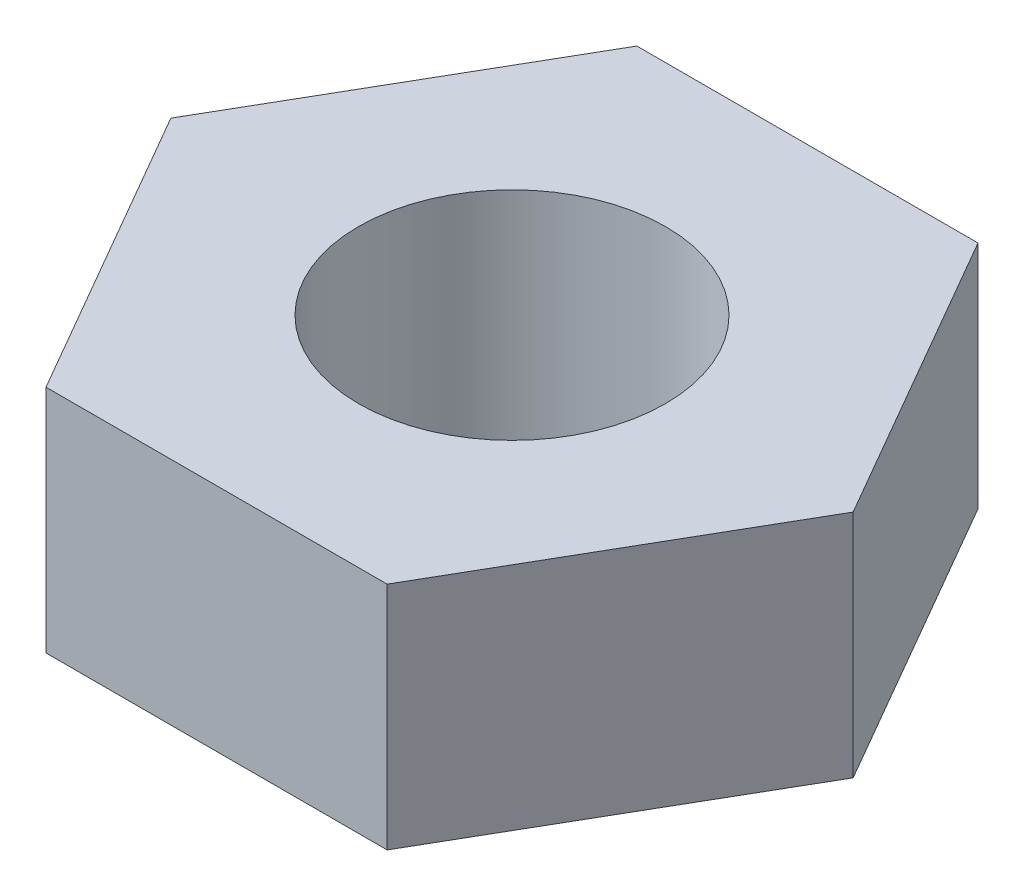
ISO-10303-21;
HEADER;
FILE_DESCRIPTION(('STEP AP214'),'2;1');
FILE_NAME('part.step','',(''),(''),'','','');
FILE_SCHEMA(('AUTOMOTIVE_DESIGN { 1 0 10303 214 1 1 1 1 }'));
ENDSEC;
DATA;
#1=APPLICATION_CONTEXT('core data for automotive mechanical design processes');
#2=APPLICATION_PROTOCOL_DEFINITION('international standard','automotive_design',2000,#1);
#3=PRODUCT_CONTEXT('',#1,'mechanical');
#4=PRODUCT('Part','Part','',(#3));
#5=PRODUCT_RELATED_PRODUCT_CATEGORY('part','',(#4));
#6=PRODUCT_DEFINITION_FORMATION('','',#4);
#7=PRODUCT_DEFINITION_CONTEXT('part definition',#1,'design');
#8=PRODUCT_DEFINITION('design','',#6,#7);
#9=PRODUCT_DEFINITION_SHAPE('','',#8);
#10=(LENGTH_UNIT() NAMED_UNIT(*) SI_UNIT(.MILLI.,.METRE.));
#11=(NAMED_UNIT(*) PLANE_ANGLE_UNIT() SI_UNIT($,.RADIAN.));
#12=(NAMED_UNIT(*) SI_UNIT($,.STERADIAN.) SOLID_ANGLE_UNIT());
#13=UNCERTAINTY_MEASURE_WITH_UNIT(LENGTH_MEASURE(1.E-05),#10,'distance_accuracy_value','');
#14=(GEOMETRIC_REPRESENTATION_CONTEXT(3) GLOBAL_UNCERTAINTY_ASSIGNED_CONTEXT((#13)) GLOBAL_UNIT_ASSIGNED_CONTEXT((#10,
#11,#12)) REPRESENTATION_CONTEXT('',''));
#15=CARTESIAN_POINT('',(0.,0.,0.));
#16=DIRECTION('',(0.,0.,1.));
#17=DIRECTION('',(1.,0.,0.));
#18=AXIS2_PLACEMENT_3D('',#15,#16,#17);
#19=CARTESIAN_POINT('',(0.,1.5,0.));
#20=DIRECTION('',(0.,1.,0.));
#21=DIRECTION('',(0.,0.,1.));
#22=AXIS2_PLACEMENT_3D('',#19,#20,#21);
#23=PLANE('',#22);
#24=DIRECTION('',(-0.5,0.,-0.866025403784439));
#25=VECTOR('',#24,1.);
#26=CARTESIAN_POINT('',(2.22279853638006,1.5,0.));
#27=LINE('',#26,#25);
#28=CARTESIAN_POINT('',(2.22279853638006,1.5,0.));
#29=VERTEX_POINT('',#28);
#30=CARTESIAN_POINT('',(1.11139926819003,1.5,-1.925));
#31=VERTEX_POINT('',#30);
#32=EDGE_CURVE('E139',#29,#31,#27,.T.);
#33=ORIENTED_EDGE('',*,*,#32,.T.);
#34=DIRECTION('',(-1.,0.,0.));
#35=VECTOR('',#34,1.);
#36=CARTESIAN_POINT('',(1.11139926819003,1.5,-1.925));
#37=LINE('',#36,#35);
#38=CARTESIAN_POINT('',(-1.11139926819003,1.5,-1.925));
#39=VERTEX_POINT('',#38);
#40=EDGE_CURVE('E97',#31,#39,#37,.T.);
#41=ORIENTED_EDGE('',*,*,#40,.T.);
#42=DIRECTION('',(-0.5,0.,0.866025403784439));
#43=VECTOR('',#42,1.);
#44=CARTESIAN_POINT('',(-1.11139926819003,1.5,-1.925));
#45=LINE('',#44,#43);
#46=CARTESIAN_POINT('',(-2.22279853638006,1.5,0.));
#47=VERTEX_POINT('',#46);
#48=EDGE_CURVE('E110',#39,#47,#45,.T.);
#49=ORIENTED_EDGE('',*,*,#48,.T.);
#50=DIRECTION('',(0.5,0.,0.866025403784439));
#51=VECTOR('',#50,1.);
#52=CARTESIAN_POINT('',(-2.22279853638006,1.5,0.));
#53=LINE('',#52,#51);
#54=CARTESIAN_POINT('',(-1.11139926819003,1.5,1.925));
#55=VERTEX_POINT('',#54);
#56=EDGE_CURVE('E104',#47,#55,#53,.T.);
#57=ORIENTED_EDGE('',*,*,#56,.T.);
#58=DIRECTION('',(1.,0.,0.));
#59=VECTOR('',#58,1.);
#60=CARTESIAN_POINT('',(-1.11139926819003,1.5,1.925));
#61=LINE('',#60,#59);
#62=CARTESIAN_POINT('',(1.11139926819003,1.5,1.925));
#63=VERTEX_POINT('',#62);
#64=EDGE_CURVE('E108',#55,#63,#61,.T.);
#65=ORIENTED_EDGE('',*,*,#64,.T.);
#66=DIRECTION('',(0.5,0.,-0.866025403784439));
#67=VECTOR('',#66,1.);
#68=CARTESIAN_POINT('',(1.11139926819003,1.5,1.925));
#69=LINE('',#68,#67);
#70=EDGE_CURVE('E60',#63,#29,#69,.T.);
#71=ORIENTED_EDGE('',*,*,#70,.T.);
#72=EDGE_LOOP('',(#33,#41,#49,#57,#65,#71));
#73=FACE_BOUND('',#72,.T.);
#74=CARTESIAN_POINT('',(0.,1.5,0.));
#75=DIRECTION('',(0.,1.,0.));
#76=DIRECTION('',(0.,0.,1.));
#77=AXIS2_PLACEMENT_3D('',#74,#75,#76);
#78=CIRCLE('',#77,1.);
#79=CARTESIAN_POINT('',(0.,1.5,1.));
#80=VERTEX_POINT('',#79);
#81=EDGE_CURVE('E132',#80,#80,#78,.T.);
#82=ORIENTED_EDGE('',*,*,#81,.F.);
#83=EDGE_LOOP('',(#82));
#84=FACE_BOUND('',#83,.T.);
#85=ADVANCED_FACE('F43',(#73,#84),#23,.T.);
#86=CARTESIAN_POINT('',(0.,0.,0.));
#87=DIRECTION('',(0.,1.,0.));
#88=DIRECTION('',(0.,0.,1.));
#89=AXIS2_PLACEMENT_3D('',#86,#87,#88);
#90=PLANE('',#89);
#91=DIRECTION('',(-0.5,0.,-0.866025403784439));
#92=VECTOR('',#91,1.);
#93=CARTESIAN_POINT('',(2.22279853638006,0.,0.));
#94=LINE('',#93,#92);
#95=CARTESIAN_POINT('',(2.22279853638006,0.,0.));
#96=VERTEX_POINT('',#95);
#97=CARTESIAN_POINT('',(1.11139926819003,0.,-1.925));
#98=VERTEX_POINT('',#97);
#99=EDGE_CURVE('E128',#96,#98,#94,.T.);
#100=ORIENTED_EDGE('',*,*,#99,.F.);
#101=DIRECTION('',(0.5,0.,-0.866025403784439));
#102=VECTOR('',#101,1.);
#103=CARTESIAN_POINT('',(1.11139926819003,0.,1.925));
#104=LINE('',#103,#102);
#105=CARTESIAN_POINT('',(1.11139926819003,0.,1.925));
#106=VERTEX_POINT('',#105);
#107=EDGE_CURVE('E89',#106,#96,#104,.T.);
#108=ORIENTED_EDGE('',*,*,#107,.F.);
#109=DIRECTION('',(1.,0.,0.));
#110=VECTOR('',#109,1.);
#111=CARTESIAN_POINT('',(-1.11139926819003,0.,1.925));
#112=LINE('',#111,#110);
#113=CARTESIAN_POINT('',(-1.11139926819003,0.,1.925));
#114=VERTEX_POINT('',#113);
#115=EDGE_CURVE('E83',#114,#106,#112,.T.);
#116=ORIENTED_EDGE('',*,*,#115,.F.);
#117=DIRECTION('',(0.5,0.,0.866025403784439));
#118=VECTOR('',#117,1.);
#119=CARTESIAN_POINT('',(-2.22279853638006,0.,0.));
#120=LINE('',#119,#118);
#121=CARTESIAN_POINT('',(-2.22279853638006,0.,0.));
#122=VERTEX_POINT('',#121);
#123=EDGE_CURVE('E118',#122,#114,#120,.T.);
#124=ORIENTED_EDGE('',*,*,#123,.F.);
#125=DIRECTION('',(-0.5,0.,0.866025403784439));
#126=VECTOR('',#125,1.);
#127=CARTESIAN_POINT('',(-1.11139926819003,0.,-1.925));
#128=LINE('',#127,#126);
#129=CARTESIAN_POINT('',(-1.11139926819003,0.,-1.925));
#130=VERTEX_POINT('',#129);
#131=EDGE_CURVE('E134',#130,#122,#128,.T.);
#132=ORIENTED_EDGE('',*,*,#131,.F.);
#133=DIRECTION('',(-1.,0.,0.));
#134=VECTOR('',#133,1.);
#135=CARTESIAN_POINT('',(1.11139926819003,0.,-1.925));
#136=LINE('',#135,#134);
#137=EDGE_CURVE('E131',#98,#130,#136,.T.);
#138=ORIENTED_EDGE('',*,*,#137,.F.);
#139=EDGE_LOOP('',(#100,#108,#116,#124,#132,#138));
#140=FACE_BOUND('',#139,.T.);
#141=CARTESIAN_POINT('',(0.,0.,0.));
#142=DIRECTION('',(0.,1.,0.));
#143=DIRECTION('',(0.,0.,1.));
#144=AXIS2_PLACEMENT_3D('',#141,#142,#143);
#145=CIRCLE('',#144,1.);
#146=CARTESIAN_POINT('',(0.,0.,1.));
#147=VERTEX_POINT('',#146);
#148=EDGE_CURVE('E268',#147,#147,#145,.T.);
#149=ORIENTED_EDGE('',*,*,#148,.T.);
#150=EDGE_LOOP('',(#149));
#151=FACE_BOUND('',#150,.T.);
#152=ADVANCED_FACE('F148',(#140,#151),#90,.F.);
#153=CARTESIAN_POINT('',(2.22279853638006,1.5,0.));
#154=DIRECTION('',(-0.866025403784439,0.,0.5));
#155=DIRECTION('',(0.5,0.,0.866025403784439));
#156=AXIS2_PLACEMENT_3D('',#153,#154,#155);
#157=PLANE('',#156);
#158=ORIENTED_EDGE('',*,*,#99,.T.);
#159=DIRECTION('',(0.,-1.,0.));
#160=VECTOR('',#159,1.);
#161=CARTESIAN_POINT('',(1.11139926819003,1.5,-1.925));
#162=LINE('',#161,#160);
#163=EDGE_CURVE('E11',#31,#98,#162,.T.);
#164=ORIENTED_EDGE('',*,*,#163,.F.);
#165=ORIENTED_EDGE('',*,*,#32,.F.);
#166=DIRECTION('',(0.,-1.,0.));
#167=VECTOR('',#166,1.);
#168=CARTESIAN_POINT('',(2.22279853638006,1.5,0.));
#169=LINE('',#168,#167);
#170=EDGE_CURVE('E124',#29,#96,#169,.T.);
#171=ORIENTED_EDGE('',*,*,#170,.T.);
#172=EDGE_LOOP('',(#158,#164,#165,#171));
#173=FACE_BOUND('',#172,.T.);
#174=ADVANCED_FACE('F45',(#173),#157,.F.);
#175=CARTESIAN_POINT('',(1.11139926819003,1.5,-1.925));
#176=DIRECTION('',(0.,0.,1.));
#177=DIRECTION('',(1.,0.,0.));
#178=AXIS2_PLACEMENT_3D('',#175,#176,#177);
#179=PLANE('',#178);
#180=ORIENTED_EDGE('',*,*,#137,.T.);
#181=DIRECTION('',(0.,-1.,0.));
#182=VECTOR('',#181,1.);
#183=CARTESIAN_POINT('',(-1.11139926819003,1.5,-1.925));
#184=LINE('',#183,#182);
#185=EDGE_CURVE('E52',#39,#130,#184,.T.);
#186=ORIENTED_EDGE('',*,*,#185,.F.);
#187=ORIENTED_EDGE('',*,*,#40,.F.);
#188=ORIENTED_EDGE('',*,*,#163,.T.);
#189=EDGE_LOOP('',(#180,#186,#187,#188));
#190=FACE_BOUND('',#189,.T.);
#191=ADVANCED_FACE('F173',(#190),#179,.F.);
#192=CARTESIAN_POINT('',(-1.11139926819003,1.5,-1.925));
#193=DIRECTION('',(0.866025403784439,0.,0.5));
#194=DIRECTION('',(0.5,0.,-0.866025403784439));
#195=AXIS2_PLACEMENT_3D('',#192,#193,#194);
#196=PLANE('',#195);
#197=ORIENTED_EDGE('',*,*,#131,.T.);
#198=DIRECTION('',(0.,-1.,0.));
#199=VECTOR('',#198,1.);
#200=CARTESIAN_POINT('',(-2.22279853638006,1.5,0.));
#201=LINE('',#200,#199);
#202=EDGE_CURVE('E119',#47,#122,#201,.T.);
#203=ORIENTED_EDGE('',*,*,#202,.F.);
#204=ORIENTED_EDGE('',*,*,#48,.F.);
#205=ORIENTED_EDGE('',*,*,#185,.T.);
#206=EDGE_LOOP('',(#197,#203,#204,#205));
#207=FACE_BOUND('',#206,.T.);
#208=ADVANCED_FACE('F145',(#207),#196,.F.);
#209=CARTESIAN_POINT('',(-2.22279853638006,1.5,0.));
#210=DIRECTION('',(0.866025403784439,0.,-0.5));
#211=DIRECTION('',(-0.5,0.,-0.866025403784439));
#212=AXIS2_PLACEMENT_3D('',#209,#210,#211);
#213=PLANE('',#212);
#214=ORIENTED_EDGE('',*,*,#123,.T.);
#215=DIRECTION('',(0.,-1.,0.));
#216=VECTOR('',#215,1.);
#217=CARTESIAN_POINT('',(-1.11139926819003,1.5,1.925));
#218=LINE('',#217,#216);
#219=EDGE_CURVE('E115',#55,#114,#218,.T.);
#220=ORIENTED_EDGE('',*,*,#219,.F.);
#221=ORIENTED_EDGE('',*,*,#56,.F.);
#222=ORIENTED_EDGE('',*,*,#202,.T.);
#223=EDGE_LOOP('',(#214,#220,#221,#222));
#224=FACE_BOUND('',#223,.T.);
#225=ADVANCED_FACE('F116',(#224),#213,.F.);
#226=CARTESIAN_POINT('',(-1.11139926819003,1.5,1.925));
#227=DIRECTION('',(0.,0.,-1.));
#228=DIRECTION('',(-1.,0.,0.));
#229=AXIS2_PLACEMENT_3D('',#226,#227,#228);
#230=PLANE('',#229);
#231=ORIENTED_EDGE('',*,*,#115,.T.);
#232=DIRECTION('',(0.,-1.,0.));
#233=VECTOR('',#232,1.);
#234=CARTESIAN_POINT('',(1.11139926819003,1.5,1.925));
#235=LINE('',#234,#233);
#236=EDGE_CURVE('E120',#63,#106,#235,.T.);
#237=ORIENTED_EDGE('',*,*,#236,.F.);
#238=ORIENTED_EDGE('',*,*,#64,.F.);
#239=ORIENTED_EDGE('',*,*,#219,.T.);
#240=EDGE_LOOP('',(#231,#237,#238,#239));
#241=FACE_BOUND('',#240,.T.);
#242=ADVANCED_FACE('F122',(#241),#230,.F.);
#243=CARTESIAN_POINT('',(1.11139926819003,1.5,1.925));
#244=DIRECTION('',(-0.866025403784439,0.,-0.5));
#245=DIRECTION('',(-0.5,0.,0.866025403784439));
#246=AXIS2_PLACEMENT_3D('',#243,#244,#245);
#247=PLANE('',#246);
#248=ORIENTED_EDGE('',*,*,#107,.T.);
#249=ORIENTED_EDGE('',*,*,#170,.F.);
#250=ORIENTED_EDGE('',*,*,#70,.F.);
#251=ORIENTED_EDGE('',*,*,#236,.T.);
#252=EDGE_LOOP('',(#248,#249,#250,#251));
#253=FACE_BOUND('',#252,.T.);
#254=ADVANCED_FACE('F153',(#253),#247,.F.);
#255=CARTESIAN_POINT('',(0.,1.5,0.));
#256=DIRECTION('',(0.,-1.,0.));
#257=DIRECTION('',(0.,0.,-1.));
#258=AXIS2_PLACEMENT_3D('',#255,#256,#257);
#259=CYLINDRICAL_SURFACE('',#258,1.);
#260=ORIENTED_EDGE('',*,*,#81,.T.);
#261=EDGE_LOOP('',(#260));
#262=FACE_BOUND('',#261,.T.);
#263=ORIENTED_EDGE('',*,*,#148,.F.);
#264=EDGE_LOOP('',(#263));
#265=FACE_BOUND('',#264,.T.);
#266=ADVANCED_FACE('F155',(#262,#265),#259,.F.);
#267=CLOSED_SHELL('',(#85,#152,#174,#191,#208,#225,#242,#254,#266));
#268=MANIFOLD_SOLID_BREP('B2',#267);
#269=ADVANCED_BREP_SHAPE_REPRESENTATION('',(#18,#268),#14);
#270=SHAPE_DEFINITION_REPRESENTATION(#9,#269);
ENDSEC;
END-ISO-10303-21;
